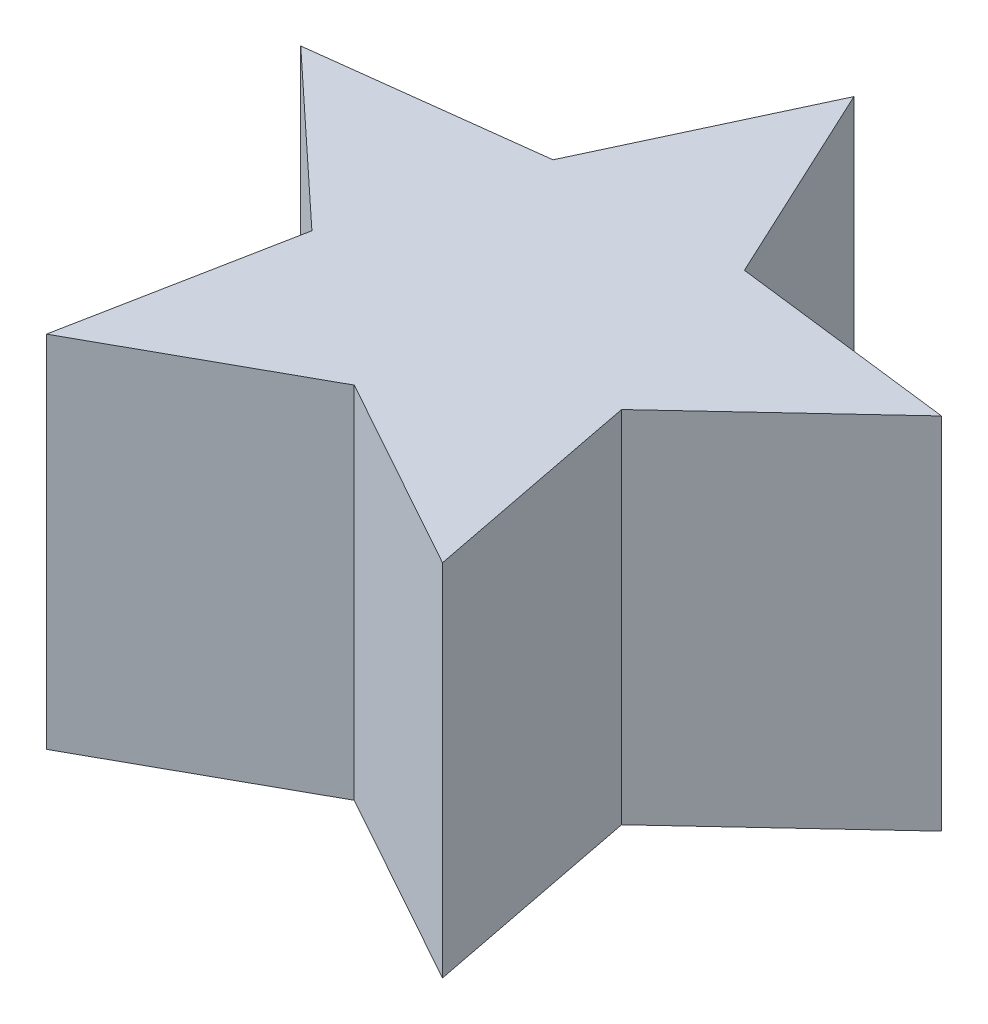
ISO-10303-21;
HEADER;
FILE_DESCRIPTION(('STEP AP214'),'2;1');
FILE_NAME('part.step','',(''),(''),'','','');
FILE_SCHEMA(('AUTOMOTIVE_DESIGN { 1 0 10303 214 1 1 1 1 }'));
ENDSEC;
DATA;
#1=APPLICATION_CONTEXT('core data for automotive mechanical design processes');
#2=APPLICATION_PROTOCOL_DEFINITION('international standard','automotive_design',2000,#1);
#3=PRODUCT_CONTEXT('',#1,'mechanical');
#4=PRODUCT('Part','Part','',(#3));
#5=PRODUCT_RELATED_PRODUCT_CATEGORY('part','',(#4));
#6=PRODUCT_DEFINITION_FORMATION('','',#4);
#7=PRODUCT_DEFINITION_CONTEXT('part definition',#1,'design');
#8=PRODUCT_DEFINITION('design','',#6,#7);
#9=PRODUCT_DEFINITION_SHAPE('','',#8);
#10=(LENGTH_UNIT() NAMED_UNIT(*) SI_UNIT(.MILLI.,.METRE.));
#11=(NAMED_UNIT(*) PLANE_ANGLE_UNIT() SI_UNIT($,.RADIAN.));
#12=(NAMED_UNIT(*) SI_UNIT($,.STERADIAN.) SOLID_ANGLE_UNIT());
#13=UNCERTAINTY_MEASURE_WITH_UNIT(LENGTH_MEASURE(1.E-05),#10,'distance_accuracy_value','');
#14=(GEOMETRIC_REPRESENTATION_CONTEXT(3) GLOBAL_UNCERTAINTY_ASSIGNED_CONTEXT((#13)) GLOBAL_UNIT_ASSIGNED_CONTEXT((#10,
#11,#12)) REPRESENTATION_CONTEXT('',''));
#15=CARTESIAN_POINT('',(0.,0.,0.));
#16=DIRECTION('',(0.,0.,1.));
#17=DIRECTION('',(1.,0.,0.));
#18=AXIS2_PLACEMENT_3D('',#15,#16,#17);
#19=CARTESIAN_POINT('',(-2.52777079935328,9.5,-3.47917802732485));
#20=DIRECTION('',(0.906307787036651,0.,0.422618261740696));
#21=DIRECTION('',(0.422618261740696,0.,-0.906307787036652));
#22=AXIS2_PLACEMENT_3D('',#19,#20,#21);
#23=PLANE('',#22);
#24=DIRECTION('',(-0.422618261740696,0.,0.906307787036652));
#25=VECTOR('',#24,1.);
#26=CARTESIAN_POINT('',(-2.52777079935328,0.,-3.47917802732485));
#27=LINE('',#26,#25);
#28=CARTESIAN_POINT('',(0.,0.,-8.9));
#29=VERTEX_POINT('',#28);
#30=CARTESIAN_POINT('',(-2.52777079935328,0.,-3.47917802732485));
#31=VERTEX_POINT('',#30);
#32=EDGE_CURVE('E148',#29,#31,#27,.T.);
#33=ORIENTED_EDGE('',*,*,#32,.T.);
#34=DIRECTION('',(0.,-1.,0.));
#35=VECTOR('',#34,1.);
#36=CARTESIAN_POINT('',(-2.52777079935328,9.5,-3.47917802732485));
#37=LINE('',#36,#35);
#38=CARTESIAN_POINT('',(-2.52777079935328,9.5,-3.47917802732485));
#39=VERTEX_POINT('',#38);
#40=EDGE_CURVE('E11',#39,#31,#37,.T.);
#41=ORIENTED_EDGE('',*,*,#40,.F.);
#42=DIRECTION('',(-0.422618261740696,0.,0.906307787036652));
#43=VECTOR('',#42,1.);
#44=CARTESIAN_POINT('',(-2.52777079935328,9.5,-3.47917802732485));
#45=LINE('',#44,#43);
#46=CARTESIAN_POINT('',(0.,9.5,-8.9));
#47=VERTEX_POINT('',#46);
#48=EDGE_CURVE('E166',#47,#39,#45,.T.);
#49=ORIENTED_EDGE('',*,*,#48,.F.);
#50=DIRECTION('',(0.,-1.,0.));
#51=VECTOR('',#50,1.);
#52=CARTESIAN_POINT('',(0.,9.5,-8.9));
#53=LINE('',#52,#51);
#54=EDGE_CURVE('E144',#47,#29,#53,.T.);
#55=ORIENTED_EDGE('',*,*,#54,.T.);
#56=EDGE_LOOP('',(#33,#41,#49,#55));
#57=FACE_BOUND('',#56,.T.);
#58=ADVANCED_FACE('F40',(#57),#23,.F.);
#59=CARTESIAN_POINT('',(-8.46440299502687,9.5,-2.75025124993704));
#60=DIRECTION('',(0.121869343405145,0.,0.992546151641322));
#61=DIRECTION('',(0.992546151641322,0.,-0.121869343405145));
#62=AXIS2_PLACEMENT_3D('',#59,#60,#61);
#63=PLANE('',#62);
#64=DIRECTION('',(-0.992546151641322,0.,0.121869343405145));
#65=VECTOR('',#64,1.);
#66=CARTESIAN_POINT('',(-8.46440299502687,0.,-2.75025124993704));
#67=LINE('',#66,#65);
#68=CARTESIAN_POINT('',(-8.46440299502687,0.,-2.75025124993704));
#69=VERTEX_POINT('',#68);
#70=EDGE_CURVE('E151',#31,#69,#67,.T.);
#71=ORIENTED_EDGE('',*,*,#70,.T.);
#72=DIRECTION('',(0.,-1.,0.));
#73=VECTOR('',#72,1.);
#74=CARTESIAN_POINT('',(-8.46440299502687,9.5,-2.75025124993704));
#75=LINE('',#74,#73);
#76=CARTESIAN_POINT('',(-8.46440299502687,9.5,-2.75025124993704));
#77=VERTEX_POINT('',#76);
#78=EDGE_CURVE('E48',#77,#69,#75,.T.);
#79=ORIENTED_EDGE('',*,*,#78,.F.);
#80=DIRECTION('',(-0.992546151641322,0.,0.121869343405145));
#81=VECTOR('',#80,1.);
#82=CARTESIAN_POINT('',(-8.46440299502687,9.5,-2.75025124993704));
#83=LINE('',#82,#81);
#84=EDGE_CURVE('E105',#39,#77,#83,.T.);
#85=ORIENTED_EDGE('',*,*,#84,.F.);
#86=ORIENTED_EDGE('',*,*,#40,.T.);
#87=EDGE_LOOP('',(#71,#79,#85,#86));
#88=FACE_BOUND('',#87,.T.);
#89=ADVANCED_FACE('F215',(#88),#63,.F.);
#90=CARTESIAN_POINT('',(-4.09001906912314,9.5,1.32892775352629));
#91=DIRECTION('',(0.681998360062499,0.,-0.73135370161917));
#92=DIRECTION('',(-0.73135370161917,0.,-0.681998360062499));
#93=AXIS2_PLACEMENT_3D('',#90,#91,#92);
#94=PLANE('',#93);
#95=DIRECTION('',(0.73135370161917,0.,0.681998360062499));
#96=VECTOR('',#95,1.);
#97=CARTESIAN_POINT('',(-4.09001906912314,0.,1.32892775352629));
#98=LINE('',#97,#96);
#99=CARTESIAN_POINT('',(-4.09001906912314,0.,1.32892775352629));
#100=VERTEX_POINT('',#99);
#101=EDGE_CURVE('E153',#69,#100,#98,.T.);
#102=ORIENTED_EDGE('',*,*,#101,.T.);
#103=DIRECTION('',(0.,-1.,0.));
#104=VECTOR('',#103,1.);
#105=CARTESIAN_POINT('',(-4.09001906912314,9.5,1.32892775352629));
#106=LINE('',#105,#104);
#107=CARTESIAN_POINT('',(-4.09001906912314,9.5,1.32892775352629));
#108=VERTEX_POINT('',#107);
#109=EDGE_CURVE('E179',#108,#100,#106,.T.);
#110=ORIENTED_EDGE('',*,*,#109,.F.);
#111=DIRECTION('',(0.73135370161917,0.,0.681998360062499));
#112=VECTOR('',#111,1.);
#113=CARTESIAN_POINT('',(-4.09001906912314,9.5,1.32892775352629));
#114=LINE('',#113,#112);
#115=EDGE_CURVE('E187',#77,#108,#114,.T.);
#116=ORIENTED_EDGE('',*,*,#115,.F.);
#117=ORIENTED_EDGE('',*,*,#78,.T.);
#118=EDGE_LOOP('',(#102,#110,#116,#117));
#119=FACE_BOUND('',#118,.T.);
#120=ADVANCED_FACE('F185',(#119),#94,.F.);
#121=CARTESIAN_POINT('',(-5.231288745403,9.5,7.20025124993704));
#122=DIRECTION('',(0.981627183447664,0.,0.190808995376543));
#123=DIRECTION('',(0.190808995376543,0.,-0.981627183447664));
#124=AXIS2_PLACEMENT_3D('',#121,#122,#123);
#125=PLANE('',#124);
#126=DIRECTION('',(-0.190808995376543,0.,0.981627183447664));
#127=VECTOR('',#126,1.);
#128=CARTESIAN_POINT('',(-5.231288745403,0.,7.20025124993704));
#129=LINE('',#128,#127);
#130=CARTESIAN_POINT('',(-5.231288745403,0.,7.20025124993704));
#131=VERTEX_POINT('',#130);
#132=EDGE_CURVE('E155',#100,#131,#129,.T.);
#133=ORIENTED_EDGE('',*,*,#132,.T.);
#134=DIRECTION('',(0.,-1.,0.));
#135=VECTOR('',#134,1.);
#136=CARTESIAN_POINT('',(-5.231288745403,9.5,7.20025124993704));
#137=LINE('',#136,#135);
#138=CARTESIAN_POINT('',(-5.231288745403,9.5,7.20025124993704));
#139=VERTEX_POINT('',#138);
#140=EDGE_CURVE('E176',#139,#131,#137,.T.);
#141=ORIENTED_EDGE('',*,*,#140,.F.);
#142=DIRECTION('',(-0.190808995376543,0.,0.981627183447664));
#143=VECTOR('',#142,1.);
#144=CARTESIAN_POINT('',(-5.231288745403,9.5,7.20025124993704));
#145=LINE('',#144,#143);
#146=EDGE_CURVE('E205',#108,#139,#145,.T.);
#147=ORIENTED_EDGE('',*,*,#146,.F.);
#148=ORIENTED_EDGE('',*,*,#109,.T.);
#149=EDGE_LOOP('',(#133,#141,#147,#148));
#150=FACE_BOUND('',#149,.T.);
#151=ADVANCED_FACE('F196',(#150),#125,.F.);
#152=CARTESIAN_POINT('',(0.,9.5,4.30050054759714));
#153=DIRECTION('',(-0.48480962024634,0.,-0.874619707139394));
#154=DIRECTION('',(-0.874619707139394,0.,0.48480962024634));
#155=AXIS2_PLACEMENT_3D('',#152,#153,#154);
#156=PLANE('',#155);
#157=DIRECTION('',(0.874619707139394,0.,-0.48480962024634));
#158=VECTOR('',#157,1.);
#159=CARTESIAN_POINT('',(0.,0.,4.30050054759714));
#160=LINE('',#159,#158);
#161=CARTESIAN_POINT('',(0.,0.,4.30050054759714));
#162=VERTEX_POINT('',#161);
#163=EDGE_CURVE('E157',#131,#162,#160,.T.);
#164=ORIENTED_EDGE('',*,*,#163,.T.);
#165=DIRECTION('',(0.,-1.,0.));
#166=VECTOR('',#165,1.);
#167=CARTESIAN_POINT('',(0.,9.5,4.30050054759714));
#168=LINE('',#167,#166);
#169=CARTESIAN_POINT('',(0.,9.5,4.30050054759714));
#170=VERTEX_POINT('',#169);
#171=EDGE_CURVE('E173',#170,#162,#168,.T.);
#172=ORIENTED_EDGE('',*,*,#171,.F.);
#173=DIRECTION('',(0.874619707139394,0.,-0.48480962024634));
#174=VECTOR('',#173,1.);
#175=CARTESIAN_POINT('',(0.,9.5,4.30050054759714));
#176=LINE('',#175,#174);
#177=EDGE_CURVE('E202',#139,#170,#176,.T.);
#178=ORIENTED_EDGE('',*,*,#177,.F.);
#179=ORIENTED_EDGE('',*,*,#140,.T.);
#180=EDGE_LOOP('',(#164,#172,#178,#179));
#181=FACE_BOUND('',#180,.T.);
#182=ADVANCED_FACE('F200',(#181),#156,.F.);
#183=CARTESIAN_POINT('',(5.23128874540302,9.5,7.20025124993703));
#184=DIRECTION('',(0.484809620246337,0.,-0.874619707139396));
#185=DIRECTION('',(-0.874619707139396,0.,-0.484809620246337));
#186=AXIS2_PLACEMENT_3D('',#183,#184,#185);
#187=PLANE('',#186);
#188=DIRECTION('',(0.874619707139396,0.,0.484809620246337));
#189=VECTOR('',#188,1.);
#190=CARTESIAN_POINT('',(5.23128874540302,0.,7.20025124993703));
#191=LINE('',#190,#189);
#192=CARTESIAN_POINT('',(5.23128874540302,0.,7.20025124993703));
#193=VERTEX_POINT('',#192);
#194=EDGE_CURVE('E159',#162,#193,#191,.T.);
#195=ORIENTED_EDGE('',*,*,#194,.T.);
#196=DIRECTION('',(0.,-1.,0.));
#197=VECTOR('',#196,1.);
#198=CARTESIAN_POINT('',(5.23128874540302,9.5,7.20025124993703));
#199=LINE('',#198,#197);
#200=CARTESIAN_POINT('',(5.23128874540302,9.5,7.20025124993703));
#201=VERTEX_POINT('',#200);
#202=EDGE_CURVE('E170',#201,#193,#199,.T.);
#203=ORIENTED_EDGE('',*,*,#202,.F.);
#204=DIRECTION('',(0.874619707139396,0.,0.484809620246337));
#205=VECTOR('',#204,1.);
#206=CARTESIAN_POINT('',(5.23128874540302,9.5,7.20025124993703));
#207=LINE('',#206,#205);
#208=EDGE_CURVE('E204',#170,#201,#207,.T.);
#209=ORIENTED_EDGE('',*,*,#208,.F.);
#210=ORIENTED_EDGE('',*,*,#171,.T.);
#211=EDGE_LOOP('',(#195,#203,#209,#210));
#212=FACE_BOUND('',#211,.T.);
#213=ADVANCED_FACE('F227',(#212),#187,.F.);
#214=CARTESIAN_POINT('',(4.09001906912312,9.5,1.32892775352628));
#215=DIRECTION('',(-0.981627183447663,0.,0.19080899537655));
#216=DIRECTION('',(0.19080899537655,0.,0.981627183447663));
#217=AXIS2_PLACEMENT_3D('',#214,#215,#216);
#218=PLANE('',#217);
#219=DIRECTION('',(-0.19080899537655,0.,-0.981627183447663));
#220=VECTOR('',#219,1.);
#221=CARTESIAN_POINT('',(4.09001906912312,0.,1.32892775352628));
#222=LINE('',#221,#220);
#223=CARTESIAN_POINT('',(4.09001906912312,0.,1.32892775352628));
#224=VERTEX_POINT('',#223);
#225=EDGE_CURVE('E161',#193,#224,#222,.T.);
#226=ORIENTED_EDGE('',*,*,#225,.T.);
#227=DIRECTION('',(0.,-1.,0.));
#228=VECTOR('',#227,1.);
#229=CARTESIAN_POINT('',(4.09001906912312,9.5,1.32892775352628));
#230=LINE('',#229,#228);
#231=CARTESIAN_POINT('',(4.09001906912312,9.5,1.32892775352628));
#232=VERTEX_POINT('',#231);
#233=EDGE_CURVE('E139',#232,#224,#230,.T.);
#234=ORIENTED_EDGE('',*,*,#233,.F.);
#235=DIRECTION('',(-0.19080899537655,0.,-0.981627183447663));
#236=VECTOR('',#235,1.);
#237=CARTESIAN_POINT('',(4.09001906912312,9.5,1.32892775352628));
#238=LINE('',#237,#236);
#239=EDGE_CURVE('E130',#201,#232,#238,.T.);
#240=ORIENTED_EDGE('',*,*,#239,.F.);
#241=ORIENTED_EDGE('',*,*,#202,.T.);
#242=EDGE_LOOP('',(#226,#234,#240,#241));
#243=FACE_BOUND('',#242,.T.);
#244=ADVANCED_FACE('F230',(#243),#218,.F.);
#245=CARTESIAN_POINT('',(8.46440299502687,9.5,-2.75025124993703));
#246=DIRECTION('',(-0.681998360062496,0.,-0.731353701619173));
#247=DIRECTION('',(-0.731353701619173,0.,0.681998360062496));
#248=AXIS2_PLACEMENT_3D('',#245,#246,#247);
#249=PLANE('',#248);
#250=DIRECTION('',(0.731353701619173,0.,-0.681998360062496));
#251=VECTOR('',#250,1.);
#252=CARTESIAN_POINT('',(8.46440299502687,0.,-2.75025124993703));
#253=LINE('',#252,#251);
#254=CARTESIAN_POINT('',(8.46440299502687,0.,-2.75025124993703));
#255=VERTEX_POINT('',#254);
#256=EDGE_CURVE('E138',#224,#255,#253,.T.);
#257=ORIENTED_EDGE('',*,*,#256,.T.);
#258=DIRECTION('',(0.,-1.,0.));
#259=VECTOR('',#258,1.);
#260=CARTESIAN_POINT('',(8.46440299502687,9.5,-2.75025124993703));
#261=LINE('',#260,#259);
#262=CARTESIAN_POINT('',(8.46440299502687,9.5,-2.75025124993703));
#263=VERTEX_POINT('',#262);
#264=EDGE_CURVE('E135',#263,#255,#261,.T.);
#265=ORIENTED_EDGE('',*,*,#264,.F.);
#266=DIRECTION('',(0.731353701619173,0.,-0.681998360062496));
#267=VECTOR('',#266,1.);
#268=CARTESIAN_POINT('',(8.46440299502687,9.5,-2.75025124993703));
#269=LINE('',#268,#267);
#270=EDGE_CURVE('E124',#232,#263,#269,.T.);
#271=ORIENTED_EDGE('',*,*,#270,.F.);
#272=ORIENTED_EDGE('',*,*,#233,.T.);
#273=EDGE_LOOP('',(#257,#265,#271,#272));
#274=FACE_BOUND('',#273,.T.);
#275=ADVANCED_FACE('F136',(#274),#249,.F.);
#276=CARTESIAN_POINT('',(2.5277707993533,9.5,-3.47917802732485));
#277=DIRECTION('',(-0.121869343405147,0.,0.992546151641322));
#278=DIRECTION('',(0.992546151641322,0.,0.121869343405147));
#279=AXIS2_PLACEMENT_3D('',#276,#277,#278);
#280=PLANE('',#279);
#281=DIRECTION('',(-0.992546151641322,0.,-0.121869343405147));
#282=VECTOR('',#281,1.);
#283=CARTESIAN_POINT('',(2.5277707993533,0.,-3.47917802732485));
#284=LINE('',#283,#282);
#285=CARTESIAN_POINT('',(2.5277707993533,0.,-3.47917802732485));
#286=VERTEX_POINT('',#285);
#287=EDGE_CURVE('E91',#255,#286,#284,.T.);
#288=ORIENTED_EDGE('',*,*,#287,.T.);
#289=DIRECTION('',(0.,-1.,0.));
#290=VECTOR('',#289,1.);
#291=CARTESIAN_POINT('',(2.5277707993533,9.5,-3.47917802732485));
#292=LINE('',#291,#290);
#293=CARTESIAN_POINT('',(2.5277707993533,9.5,-3.47917802732485));
#294=VERTEX_POINT('',#293);
#295=EDGE_CURVE('E140',#294,#286,#292,.T.);
#296=ORIENTED_EDGE('',*,*,#295,.F.);
#297=DIRECTION('',(-0.992546151641322,0.,-0.121869343405147));
#298=VECTOR('',#297,1.);
#299=CARTESIAN_POINT('',(2.5277707993533,9.5,-3.47917802732485));
#300=LINE('',#299,#298);
#301=EDGE_CURVE('E128',#263,#294,#300,.T.);
#302=ORIENTED_EDGE('',*,*,#301,.F.);
#303=ORIENTED_EDGE('',*,*,#264,.T.);
#304=EDGE_LOOP('',(#288,#296,#302,#303));
#305=FACE_BOUND('',#304,.T.);
#306=ADVANCED_FACE('F142',(#305),#280,.F.);
#307=CARTESIAN_POINT('',(0.,9.5,-8.9));
#308=DIRECTION('',(-0.906307787036651,0.,0.422618261740698));
#309=DIRECTION('',(0.422618261740698,0.,0.90630778703665));
#310=AXIS2_PLACEMENT_3D('',#307,#308,#309);
#311=PLANE('',#310);
#312=DIRECTION('',(-0.422618261740698,0.,-0.906307787036651));
#313=VECTOR('',#312,1.);
#314=CARTESIAN_POINT('',(0.,0.,-8.9));
#315=LINE('',#314,#313);
#316=EDGE_CURVE('E97',#286,#29,#315,.T.);
#317=ORIENTED_EDGE('',*,*,#316,.T.);
#318=ORIENTED_EDGE('',*,*,#54,.F.);
#319=DIRECTION('',(-0.422618261740698,0.,-0.906307787036651));
#320=VECTOR('',#319,1.);
#321=CARTESIAN_POINT('',(0.,9.5,-8.9));
#322=LINE('',#321,#320);
#323=EDGE_CURVE('E56',#294,#47,#322,.T.);
#324=ORIENTED_EDGE('',*,*,#323,.F.);
#325=ORIENTED_EDGE('',*,*,#295,.T.);
#326=EDGE_LOOP('',(#317,#318,#324,#325));
#327=FACE_BOUND('',#326,.T.);
#328=ADVANCED_FACE('F239',(#327),#311,.F.);
#329=CARTESIAN_POINT('',(0.,9.5,0.));
#330=DIRECTION('',(0.,1.,0.));
#331=DIRECTION('',(0.,0.,1.));
#332=AXIS2_PLACEMENT_3D('',#329,#330,#331);
#333=PLANE('',#332);
#334=ORIENTED_EDGE('',*,*,#48,.T.);
#335=ORIENTED_EDGE('',*,*,#84,.T.);
#336=ORIENTED_EDGE('',*,*,#115,.T.);
#337=ORIENTED_EDGE('',*,*,#146,.T.);
#338=ORIENTED_EDGE('',*,*,#177,.T.);
#339=ORIENTED_EDGE('',*,*,#208,.T.);
#340=ORIENTED_EDGE('',*,*,#239,.T.);
#341=ORIENTED_EDGE('',*,*,#270,.T.);
#342=ORIENTED_EDGE('',*,*,#301,.T.);
#343=ORIENTED_EDGE('',*,*,#323,.T.);
#344=EDGE_LOOP('',(#334,#335,#336,#337,#338,#339,#340,#341,#342,#343));
#345=FACE_BOUND('',#344,.T.);
#346=ADVANCED_FACE('F126',(#345),#333,.T.);
#347=CARTESIAN_POINT('',(0.,0.,0.));
#348=DIRECTION('',(0.,1.,0.));
#349=DIRECTION('',(0.,0.,1.));
#350=AXIS2_PLACEMENT_3D('',#347,#348,#349);
#351=PLANE('',#350);
#352=ORIENTED_EDGE('',*,*,#32,.F.);
#353=ORIENTED_EDGE('',*,*,#316,.F.);
#354=ORIENTED_EDGE('',*,*,#287,.F.);
#355=ORIENTED_EDGE('',*,*,#256,.F.);
#356=ORIENTED_EDGE('',*,*,#225,.F.);
#357=ORIENTED_EDGE('',*,*,#194,.F.);
#358=ORIENTED_EDGE('',*,*,#163,.F.);
#359=ORIENTED_EDGE('',*,*,#132,.F.);
#360=ORIENTED_EDGE('',*,*,#101,.F.);
#361=ORIENTED_EDGE('',*,*,#70,.F.);
#362=EDGE_LOOP('',(#352,#353,#354,#355,#356,#357,#358,#359,#360,#361));
#363=FACE_BOUND('',#362,.T.);
#364=ADVANCED_FACE('F191',(#363),#351,.F.);
#365=CLOSED_SHELL('',(#58,#89,#120,#151,#182,#213,#244,#275,#306,#328,#346,#364));
#366=MANIFOLD_SOLID_BREP('B2',#365);
#367=ADVANCED_BREP_SHAPE_REPRESENTATION('',(#18,#366),#14);
#368=SHAPE_DEFINITION_REPRESENTATION(#9,#367);
ENDSEC;
END-ISO-10303-21;
